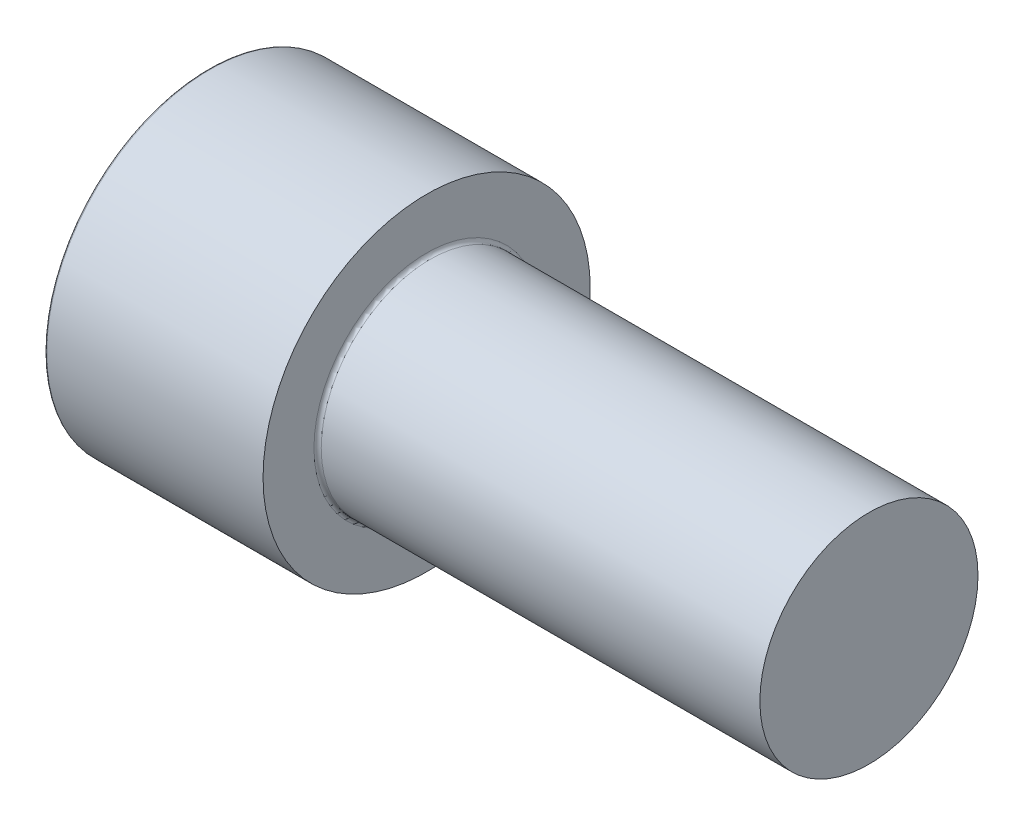
ISO-10303-21;
HEADER;
FILE_DESCRIPTION(('STEP AP214'),'2;1');
FILE_NAME('part.step','',(''),(''),'','','');
FILE_SCHEMA(('AUTOMOTIVE_DESIGN { 1 0 10303 214 1 1 1 1 }'));
ENDSEC;
DATA;
#1=APPLICATION_CONTEXT('core data for automotive mechanical design processes');
#2=APPLICATION_PROTOCOL_DEFINITION('international standard','automotive_design',2000,#1);
#3=PRODUCT_CONTEXT('',#1,'mechanical');
#4=PRODUCT('Part','Part','',(#3));
#5=PRODUCT_RELATED_PRODUCT_CATEGORY('part','',(#4));
#6=PRODUCT_DEFINITION_FORMATION('','',#4);
#7=PRODUCT_DEFINITION_CONTEXT('part definition',#1,'design');
#8=PRODUCT_DEFINITION('design','',#6,#7);
#9=PRODUCT_DEFINITION_SHAPE('','',#8);
#10=(LENGTH_UNIT() NAMED_UNIT(*) SI_UNIT(.MILLI.,.METRE.));
#11=(NAMED_UNIT(*) PLANE_ANGLE_UNIT() SI_UNIT($,.RADIAN.));
#12=(NAMED_UNIT(*) SI_UNIT($,.STERADIAN.) SOLID_ANGLE_UNIT());
#13=UNCERTAINTY_MEASURE_WITH_UNIT(LENGTH_MEASURE(1.E-05),#10,'distance_accuracy_value','');
#14=(GEOMETRIC_REPRESENTATION_CONTEXT(3) GLOBAL_UNCERTAINTY_ASSIGNED_CONTEXT((#13)) GLOBAL_UNIT_ASSIGNED_CONTEXT((#10,
#11,#12)) REPRESENTATION_CONTEXT('',''));
#15=CARTESIAN_POINT('',(0.,0.,0.));
#16=DIRECTION('',(0.,0.,1.));
#17=DIRECTION('',(1.,0.,0.));
#18=AXIS2_PLACEMENT_3D('',#15,#16,#17);
#19=CARTESIAN_POINT('',(0.,0.,0.));
#20=DIRECTION('',(-1.,0.,0.));
#21=DIRECTION('',(0.,0.,1.));
#22=AXIS2_PLACEMENT_3D('',#19,#20,#21);
#23=CYLINDRICAL_SURFACE('',#22,6.);
#24=CARTESIAN_POINT('',(12.2,0.,0.));
#25=DIRECTION('',(-1.,0.,0.));
#26=DIRECTION('',(0.,0.,1.));
#27=AXIS2_PLACEMENT_3D('',#24,#25,#26);
#28=CIRCLE('',#27,6.);
#29=CARTESIAN_POINT('',(12.2,0.,6.));
#30=VERTEX_POINT('',#29);
#31=EDGE_CURVE('E150',#30,#30,#28,.T.);
#32=ORIENTED_EDGE('',*,*,#31,.F.);
#33=EDGE_LOOP('',(#32));
#34=FACE_BOUND('',#33,.T.);
#35=CARTESIAN_POINT('',(36.3317755344286,0.,0.));
#36=DIRECTION('',(1.,0.,0.));
#37=DIRECTION('',(0.,0.,-1.));
#38=AXIS2_PLACEMENT_3D('',#35,#36,#37);
#39=CIRCLE('',#38,6.);
#40=CARTESIAN_POINT('',(36.3317755344286,0.,-6.));
#41=VERTEX_POINT('',#40);
#42=EDGE_CURVE('E11',#41,#41,#39,.T.);
#43=ORIENTED_EDGE('',*,*,#42,.F.);
#44=EDGE_LOOP('',(#43));
#45=FACE_BOUND('',#44,.T.);
#46=ADVANCED_FACE('F44',(#34,#45),#23,.T.);
#47=CARTESIAN_POINT('',(0.,0.,0.));
#48=DIRECTION('',(1.,0.,0.));
#49=DIRECTION('',(0.,0.,-1.));
#50=AXIS2_PLACEMENT_3D('',#47,#48,#49);
#51=PLANE('',#50);
#52=CARTESIAN_POINT('',(0.,0.,0.));
#53=DIRECTION('',(1.,0.,0.));
#54=DIRECTION('',(0.,0.,-1.));
#55=AXIS2_PLACEMENT_3D('',#52,#53,#54);
#56=CIRCLE('',#55,8.9);
#57=CARTESIAN_POINT('',(0.,0.,-8.9));
#58=VERTEX_POINT('',#57);
#59=EDGE_CURVE('E162',#58,#58,#56,.F.);
#60=ORIENTED_EDGE('',*,*,#59,.T.);
#61=EDGE_LOOP('',(#60));
#62=FACE_BOUND('',#61,.T.);
#63=DIRECTION('',(0.,0.866025403784438,-0.5));
#64=VECTOR('',#63,1.);
#65=CARTESIAN_POINT('',(0.,0.,5.715));
#66=LINE('',#65,#64);
#67=CARTESIAN_POINT('',(0.,0.,5.715));
#68=VERTEX_POINT('',#67);
#69=CARTESIAN_POINT('',(0.,4.94933518262807,2.8575));
#70=VERTEX_POINT('',#69);
#71=EDGE_CURVE('E132',#68,#70,#66,.T.);
#72=ORIENTED_EDGE('',*,*,#71,.F.);
#73=DIRECTION('',(0.,0.866025403784439,0.5));
#74=VECTOR('',#73,1.);
#75=CARTESIAN_POINT('',(0.,-4.94933518262807,2.8575));
#76=LINE('',#75,#74);
#77=CARTESIAN_POINT('',(0.,-4.94933518262807,2.8575));
#78=VERTEX_POINT('',#77);
#79=EDGE_CURVE('E58',#78,#68,#76,.T.);
#80=ORIENTED_EDGE('',*,*,#79,.F.);
#81=DIRECTION('',(0.,0.,1.));
#82=VECTOR('',#81,1.);
#83=CARTESIAN_POINT('',(0.,-4.94933518262807,-2.8575));
#84=LINE('',#83,#82);
#85=CARTESIAN_POINT('',(0.,-4.94933518262807,-2.8575));
#86=VERTEX_POINT('',#85);
#87=EDGE_CURVE('E141',#86,#78,#84,.T.);
#88=ORIENTED_EDGE('',*,*,#87,.F.);
#89=DIRECTION('',(0.,-0.866025403784439,0.5));
#90=VECTOR('',#89,1.);
#91=CARTESIAN_POINT('',(0.,0.,-5.715));
#92=LINE('',#91,#90);
#93=CARTESIAN_POINT('',(0.,0.,-5.715));
#94=VERTEX_POINT('',#93);
#95=EDGE_CURVE('E142',#94,#86,#92,.T.);
#96=ORIENTED_EDGE('',*,*,#95,.F.);
#97=DIRECTION('',(0.,-0.866025403784439,-0.5));
#98=VECTOR('',#97,1.);
#99=CARTESIAN_POINT('',(0.,4.94933518262807,-2.8575));
#100=LINE('',#99,#98);
#101=CARTESIAN_POINT('',(0.,4.94933518262807,-2.8575));
#102=VERTEX_POINT('',#101);
#103=EDGE_CURVE('E108',#102,#94,#100,.T.);
#104=ORIENTED_EDGE('',*,*,#103,.F.);
#105=DIRECTION('',(0.,0.,-1.));
#106=VECTOR('',#105,1.);
#107=CARTESIAN_POINT('',(0.,4.94933518262807,2.8575));
#108=LINE('',#107,#106);
#109=EDGE_CURVE('E139',#70,#102,#108,.T.);
#110=ORIENTED_EDGE('',*,*,#109,.F.);
#111=EDGE_LOOP('',(#72,#80,#88,#96,#104,#110));
#112=FACE_BOUND('',#111,.T.);
#113=ADVANCED_FACE('F174',(#62,#112),#51,.F.);
#114=CARTESIAN_POINT('',(0.,0.,0.));
#115=DIRECTION('',(-1.,0.,0.));
#116=DIRECTION('',(0.,0.,1.));
#117=AXIS2_PLACEMENT_3D('',#114,#115,#116);
#118=CYLINDRICAL_SURFACE('',#117,9.);
#119=CARTESIAN_POINT('',(0.1,0.,0.));
#120=DIRECTION('',(1.,0.,0.));
#121=DIRECTION('',(0.,0.,-1.));
#122=AXIS2_PLACEMENT_3D('',#119,#120,#121);
#123=CIRCLE('',#122,9.);
#124=CARTESIAN_POINT('',(0.1,0.,-9.));
#125=VERTEX_POINT('',#124);
#126=EDGE_CURVE('E52',#125,#125,#123,.T.);
#127=ORIENTED_EDGE('',*,*,#126,.T.);
#128=EDGE_LOOP('',(#127));
#129=FACE_BOUND('',#128,.T.);
#130=CARTESIAN_POINT('',(12.,0.,0.));
#131=DIRECTION('',(-1.,0.,0.));
#132=DIRECTION('',(0.,0.,1.));
#133=AXIS2_PLACEMENT_3D('',#130,#131,#132);
#134=CIRCLE('',#133,9.);
#135=CARTESIAN_POINT('',(12.,0.,9.));
#136=VERTEX_POINT('',#135);
#137=EDGE_CURVE('E157',#136,#136,#134,.T.);
#138=ORIENTED_EDGE('',*,*,#137,.T.);
#139=EDGE_LOOP('',(#138));
#140=FACE_BOUND('',#139,.T.);
#141=ADVANCED_FACE('F170',(#129,#140),#118,.T.);
#142=CARTESIAN_POINT('',(12.,9.,0.));
#143=DIRECTION('',(-1.,0.,0.));
#144=DIRECTION('',(0.,0.,1.));
#145=AXIS2_PLACEMENT_3D('',#142,#143,#144);
#146=PLANE('',#145);
#147=ORIENTED_EDGE('',*,*,#137,.F.);
#148=EDGE_LOOP('',(#147));
#149=FACE_BOUND('',#148,.T.);
#150=CARTESIAN_POINT('',(12.,0.,0.));
#151=DIRECTION('',(-1.,0.,0.));
#152=DIRECTION('',(0.,0.,1.));
#153=AXIS2_PLACEMENT_3D('',#150,#151,#152);
#154=CIRCLE('',#153,6.2);
#155=CARTESIAN_POINT('',(12.,0.,6.2));
#156=VERTEX_POINT('',#155);
#157=EDGE_CURVE('E154',#156,#156,#154,.T.);
#158=ORIENTED_EDGE('',*,*,#157,.T.);
#159=EDGE_LOOP('',(#158));
#160=FACE_BOUND('',#159,.T.);
#161=ADVANCED_FACE('F191',(#149,#160),#146,.F.);
#162=CARTESIAN_POINT('',(12.2,0.,0.));
#163=DIRECTION('',(-1.,0.,0.));
#164=DIRECTION('',(0.,0.,1.));
#165=AXIS2_PLACEMENT_3D('',#162,#163,#164);
#166=TOROIDAL_SURFACE('',#165,6.2,0.199999999999999);
#167=ORIENTED_EDGE('',*,*,#157,.F.);
#168=EDGE_LOOP('',(#167));
#169=FACE_BOUND('',#168,.T.);
#170=ORIENTED_EDGE('',*,*,#31,.T.);
#171=EDGE_LOOP('',(#170));
#172=FACE_BOUND('',#171,.T.);
#173=ADVANCED_FACE('F190',(#169,#172),#166,.F.);
#174=CARTESIAN_POINT('',(6.,-4.94933518262807,2.8575));
#175=DIRECTION('',(0.,-0.5,0.866025403784439));
#176=DIRECTION('',(0.,-0.866025403784439,-0.5));
#177=AXIS2_PLACEMENT_3D('',#174,#175,#176);
#178=PLANE('',#177);
#179=ORIENTED_EDGE('',*,*,#79,.T.);
#180=DIRECTION('',(-1.,0.,0.));
#181=VECTOR('',#180,1.);
#182=CARTESIAN_POINT('',(6.,0.,5.715));
#183=LINE('',#182,#181);
#184=CARTESIAN_POINT('',(6.,0.,5.715));
#185=VERTEX_POINT('',#184);
#186=EDGE_CURVE('E89',#185,#68,#183,.T.);
#187=ORIENTED_EDGE('',*,*,#186,.F.);
#188=DIRECTION('',(0.,0.866025403784439,0.5));
#189=VECTOR('',#188,1.);
#190=CARTESIAN_POINT('',(6.,-4.94933518262807,2.8575));
#191=LINE('',#190,#189);
#192=CARTESIAN_POINT('',(6.,-4.94933518262807,2.8575));
#193=VERTEX_POINT('',#192);
#194=EDGE_CURVE('E143',#193,#185,#191,.T.);
#195=ORIENTED_EDGE('',*,*,#194,.F.);
#196=DIRECTION('',(-1.,0.,0.));
#197=VECTOR('',#196,1.);
#198=CARTESIAN_POINT('',(6.,-4.94933518262807,2.8575));
#199=LINE('',#198,#197);
#200=EDGE_CURVE('E68',#193,#78,#199,.T.);
#201=ORIENTED_EDGE('',*,*,#200,.T.);
#202=EDGE_LOOP('',(#179,#187,#195,#201));
#203=FACE_BOUND('',#202,.T.);
#204=ADVANCED_FACE('F183',(#203),#178,.F.);
#205=CARTESIAN_POINT('',(6.,-4.94933518262807,-2.8575));
#206=DIRECTION('',(0.,-1.,0.));
#207=DIRECTION('',(0.,0.,-1.));
#208=AXIS2_PLACEMENT_3D('',#205,#206,#207);
#209=PLANE('',#208);
#210=ORIENTED_EDGE('',*,*,#87,.T.);
#211=ORIENTED_EDGE('',*,*,#200,.F.);
#212=DIRECTION('',(0.,0.,1.));
#213=VECTOR('',#212,1.);
#214=CARTESIAN_POINT('',(6.,-4.94933518262807,-2.8575));
#215=LINE('',#214,#213);
#216=CARTESIAN_POINT('',(6.,-4.94933518262807,-2.8575));
#217=VERTEX_POINT('',#216);
#218=EDGE_CURVE('E119',#217,#193,#215,.T.);
#219=ORIENTED_EDGE('',*,*,#218,.F.);
#220=DIRECTION('',(-1.,0.,0.));
#221=VECTOR('',#220,1.);
#222=CARTESIAN_POINT('',(6.,-4.94933518262807,-2.8575));
#223=LINE('',#222,#221);
#224=EDGE_CURVE('E115',#217,#86,#223,.T.);
#225=ORIENTED_EDGE('',*,*,#224,.T.);
#226=EDGE_LOOP('',(#210,#211,#219,#225));
#227=FACE_BOUND('',#226,.T.);
#228=ADVANCED_FACE('F187',(#227),#209,.F.);
#229=CARTESIAN_POINT('',(6.,0.,-5.715));
#230=DIRECTION('',(0.,-0.5,-0.866025403784438));
#231=DIRECTION('',(0.,0.866025403784439,-0.5));
#232=AXIS2_PLACEMENT_3D('',#229,#230,#231);
#233=PLANE('',#232);
#234=ORIENTED_EDGE('',*,*,#95,.T.);
#235=ORIENTED_EDGE('',*,*,#224,.F.);
#236=DIRECTION('',(0.,-0.866025403784439,0.5));
#237=VECTOR('',#236,1.);
#238=CARTESIAN_POINT('',(6.,0.,-5.715));
#239=LINE('',#238,#237);
#240=CARTESIAN_POINT('',(6.,0.,-5.715));
#241=VERTEX_POINT('',#240);
#242=EDGE_CURVE('E116',#241,#217,#239,.T.);
#243=ORIENTED_EDGE('',*,*,#242,.F.);
#244=DIRECTION('',(-1.,0.,0.));
#245=VECTOR('',#244,1.);
#246=CARTESIAN_POINT('',(6.,0.,-5.715));
#247=LINE('',#246,#245);
#248=EDGE_CURVE('E103',#241,#94,#247,.T.);
#249=ORIENTED_EDGE('',*,*,#248,.T.);
#250=EDGE_LOOP('',(#234,#235,#243,#249));
#251=FACE_BOUND('',#250,.T.);
#252=ADVANCED_FACE('F120',(#251),#233,.F.);
#253=CARTESIAN_POINT('',(6.,4.94933518262807,-2.8575));
#254=DIRECTION('',(0.,0.5,-0.866025403784439));
#255=DIRECTION('',(0.,0.866025403784439,0.5));
#256=AXIS2_PLACEMENT_3D('',#253,#254,#255);
#257=PLANE('',#256);
#258=ORIENTED_EDGE('',*,*,#103,.T.);
#259=ORIENTED_EDGE('',*,*,#248,.F.);
#260=DIRECTION('',(0.,-0.866025403784439,-0.5));
#261=VECTOR('',#260,1.);
#262=CARTESIAN_POINT('',(6.,4.94933518262807,-2.8575));
#263=LINE('',#262,#261);
#264=CARTESIAN_POINT('',(6.,4.94933518262807,-2.8575));
#265=VERTEX_POINT('',#264);
#266=EDGE_CURVE('E102',#265,#241,#263,.T.);
#267=ORIENTED_EDGE('',*,*,#266,.F.);
#268=DIRECTION('',(-1.,0.,0.));
#269=VECTOR('',#268,1.);
#270=CARTESIAN_POINT('',(6.,4.94933518262807,-2.8575));
#271=LINE('',#270,#269);
#272=EDGE_CURVE('E113',#265,#102,#271,.T.);
#273=ORIENTED_EDGE('',*,*,#272,.T.);
#274=EDGE_LOOP('',(#258,#259,#267,#273));
#275=FACE_BOUND('',#274,.T.);
#276=ADVANCED_FACE('F101',(#275),#257,.F.);
#277=CARTESIAN_POINT('',(6.,4.94933518262807,2.8575));
#278=DIRECTION('',(0.,1.,0.));
#279=DIRECTION('',(0.,0.,1.));
#280=AXIS2_PLACEMENT_3D('',#277,#278,#279);
#281=PLANE('',#280);
#282=ORIENTED_EDGE('',*,*,#109,.T.);
#283=ORIENTED_EDGE('',*,*,#272,.F.);
#284=DIRECTION('',(0.,0.,-1.));
#285=VECTOR('',#284,1.);
#286=CARTESIAN_POINT('',(6.,4.94933518262807,2.8575));
#287=LINE('',#286,#285);
#288=CARTESIAN_POINT('',(6.,4.94933518262807,2.8575));
#289=VERTEX_POINT('',#288);
#290=EDGE_CURVE('E127',#289,#265,#287,.T.);
#291=ORIENTED_EDGE('',*,*,#290,.F.);
#292=DIRECTION('',(-1.,0.,0.));
#293=VECTOR('',#292,1.);
#294=CARTESIAN_POINT('',(6.,4.94933518262807,2.8575));
#295=LINE('',#294,#293);
#296=EDGE_CURVE('E148',#289,#70,#295,.T.);
#297=ORIENTED_EDGE('',*,*,#296,.T.);
#298=EDGE_LOOP('',(#282,#283,#291,#297));
#299=FACE_BOUND('',#298,.T.);
#300=ADVANCED_FACE('F245',(#299),#281,.F.);
#301=CARTESIAN_POINT('',(6.,0.,5.715));
#302=DIRECTION('',(0.,0.5,0.866025403784439));
#303=DIRECTION('',(0.,-0.866025403784439,0.5));
#304=AXIS2_PLACEMENT_3D('',#301,#302,#303);
#305=PLANE('',#304);
#306=ORIENTED_EDGE('',*,*,#71,.T.);
#307=ORIENTED_EDGE('',*,*,#296,.F.);
#308=DIRECTION('',(0.,0.866025403784438,-0.5));
#309=VECTOR('',#308,1.);
#310=CARTESIAN_POINT('',(6.,0.,5.715));
#311=LINE('',#310,#309);
#312=EDGE_CURVE('E129',#185,#289,#311,.T.);
#313=ORIENTED_EDGE('',*,*,#312,.F.);
#314=ORIENTED_EDGE('',*,*,#186,.T.);
#315=EDGE_LOOP('',(#306,#307,#313,#314));
#316=FACE_BOUND('',#315,.T.);
#317=ADVANCED_FACE('F185',(#316),#305,.F.);
#318=CARTESIAN_POINT('',(6.,-4.94933518262807,2.8575));
#319=DIRECTION('',(1.,0.,0.));
#320=DIRECTION('',(0.,0.,-1.));
#321=AXIS2_PLACEMENT_3D('',#318,#319,#320);
#322=PLANE('',#321);
#323=ORIENTED_EDGE('',*,*,#194,.T.);
#324=ORIENTED_EDGE('',*,*,#312,.T.);
#325=ORIENTED_EDGE('',*,*,#290,.T.);
#326=ORIENTED_EDGE('',*,*,#266,.T.);
#327=ORIENTED_EDGE('',*,*,#242,.T.);
#328=ORIENTED_EDGE('',*,*,#218,.T.);
#329=EDGE_LOOP('',(#323,#324,#325,#326,#327,#328));
#330=FACE_BOUND('',#329,.T.);
#331=ADVANCED_FACE('F124',(#330),#322,.F.);
#332=CARTESIAN_POINT('',(0.1,0.,0.));
#333=DIRECTION('',(1.,0.,0.));
#334=DIRECTION('',(0.,0.,-1.));
#335=AXIS2_PLACEMENT_3D('',#332,#333,#334);
#336=TOROIDAL_SURFACE('',#335,8.9,0.1);
#337=ORIENTED_EDGE('',*,*,#126,.F.);
#338=EDGE_LOOP('',(#337));
#339=FACE_BOUND('',#338,.T.);
#340=ORIENTED_EDGE('',*,*,#59,.F.);
#341=EDGE_LOOP('',(#340));
#342=FACE_BOUND('',#341,.T.);
#343=ADVANCED_FACE('F50',(#339,#342),#336,.T.);
#344=CARTESIAN_POINT('',(36.3317755344286,10.9927933706136,85.532445175068));
#345=DIRECTION('',(1.,0.,0.));
#346=DIRECTION('',(0.,0.,-1.));
#347=AXIS2_PLACEMENT_3D('',#344,#345,#346);
#348=PLANE('',#347);
#349=ORIENTED_EDGE('',*,*,#42,.T.);
#350=EDGE_LOOP('',(#349));
#351=FACE_BOUND('',#350,.T.);
#352=ADVANCED_FACE('F175',(#351),#348,.T.);
#353=CLOSED_SHELL('',(#46,#113,#141,#161,#173,#204,#228,#252,#276,#300,#317,#331,#343,#352));
#354=MANIFOLD_SOLID_BREP('B2',#353);
#355=ADVANCED_BREP_SHAPE_REPRESENTATION('',(#18,#354),#14);
#356=SHAPE_DEFINITION_REPRESENTATION(#9,#355);
ENDSEC;
END-ISO-10303-21;
